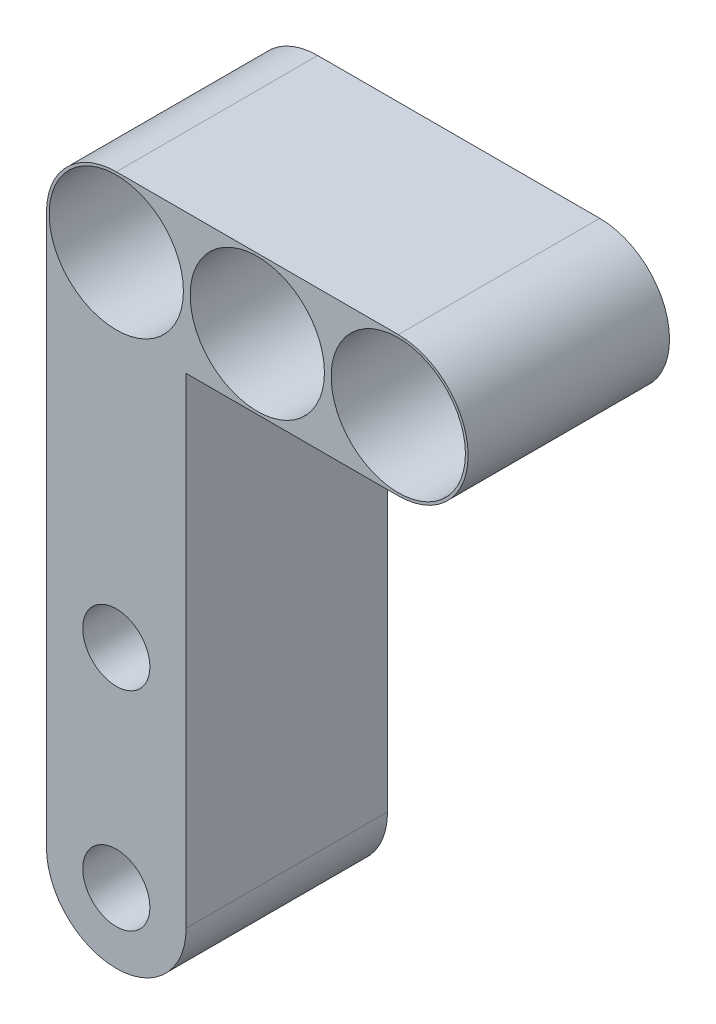
ISO-10303-21;
HEADER;
FILE_DESCRIPTION(('STEP AP214'),'2;1');
FILE_NAME('part.step','',(''),(''),'','','');
FILE_SCHEMA(('AUTOMOTIVE_DESIGN { 1 0 10303 214 1 1 1 1 }'));
ENDSEC;
DATA;
#1=APPLICATION_CONTEXT('core data for automotive mechanical design processes');
#2=APPLICATION_PROTOCOL_DEFINITION('international standard','automotive_design',2000,#1);
#3=PRODUCT_CONTEXT('',#1,'mechanical');
#4=PRODUCT('Part','Part','',(#3));
#5=PRODUCT_RELATED_PRODUCT_CATEGORY('part','',(#4));
#6=PRODUCT_DEFINITION_FORMATION('','',#4);
#7=PRODUCT_DEFINITION_CONTEXT('part definition',#1,'design');
#8=PRODUCT_DEFINITION('design','',#6,#7);
#9=PRODUCT_DEFINITION_SHAPE('','',#8);
#10=(LENGTH_UNIT() NAMED_UNIT(*) SI_UNIT(.MILLI.,.METRE.));
#11=(NAMED_UNIT(*) PLANE_ANGLE_UNIT() SI_UNIT($,.RADIAN.));
#12=(NAMED_UNIT(*) SI_UNIT($,.STERADIAN.) SOLID_ANGLE_UNIT());
#13=UNCERTAINTY_MEASURE_WITH_UNIT(LENGTH_MEASURE(1.E-05),#10,'distance_accuracy_value','');
#14=(GEOMETRIC_REPRESENTATION_CONTEXT(3) GLOBAL_UNCERTAINTY_ASSIGNED_CONTEXT((#13)) GLOBAL_UNIT_ASSIGNED_CONTEXT((#10,
#11,#12)) REPRESENTATION_CONTEXT('',''));
#15=CARTESIAN_POINT('',(0.,0.,0.));
#16=DIRECTION('',(0.,0.,1.));
#17=DIRECTION('',(1.,0.,0.));
#18=AXIS2_PLACEMENT_3D('',#15,#16,#17);
#19=CARTESIAN_POINT('',(0.,-0.52,1.5));
#20=DIRECTION('',(0.,1.,0.));
#21=DIRECTION('',(0.,0.,1.));
#22=AXIS2_PLACEMENT_3D('',#19,#20,#21);
#23=PLANE('',#22);
#24=DIRECTION('',(1.,0.,0.));
#25=VECTOR('',#24,1.);
#26=CARTESIAN_POINT('',(0.,-0.52,0.));
#27=LINE('',#26,#25);
#28=CARTESIAN_POINT('',(0.520000000000016,-0.52,0.));
#29=VERTEX_POINT('',#28);
#30=CARTESIAN_POINT('',(2.1,-0.52,0.));
#31=VERTEX_POINT('',#30);
#32=EDGE_CURVE('E142',#29,#31,#27,.T.);
#33=ORIENTED_EDGE('',*,*,#32,.T.);
#34=DIRECTION('',(0.,0.,-1.));
#35=VECTOR('',#34,1.);
#36=CARTESIAN_POINT('',(2.1,-0.52,1.5));
#37=LINE('',#36,#35);
#38=CARTESIAN_POINT('',(2.1,-0.52,1.5));
#39=VERTEX_POINT('',#38);
#40=EDGE_CURVE('E11',#39,#31,#37,.T.);
#41=ORIENTED_EDGE('',*,*,#40,.F.);
#42=DIRECTION('',(1.,0.,0.));
#43=VECTOR('',#42,1.);
#44=CARTESIAN_POINT('',(0.,-0.52,1.5));
#45=LINE('',#44,#43);
#46=CARTESIAN_POINT('',(0.520000000000016,-0.52,1.5));
#47=VERTEX_POINT('',#46);
#48=EDGE_CURVE('E171',#47,#39,#45,.T.);
#49=ORIENTED_EDGE('',*,*,#48,.F.);
#50=DIRECTION('',(0.,0.,-1.));
#51=VECTOR('',#50,1.);
#52=CARTESIAN_POINT('',(0.520000000000016,-0.52,1.5));
#53=LINE('',#52,#51);
#54=EDGE_CURVE('E141',#47,#29,#53,.T.);
#55=ORIENTED_EDGE('',*,*,#54,.T.);
#56=EDGE_LOOP('',(#33,#41,#49,#55));
#57=FACE_BOUND('',#56,.T.);
#58=ADVANCED_FACE('F35',(#57),#23,.F.);
#59=CARTESIAN_POINT('',(2.1,0.,1.5));
#60=DIRECTION('',(0.,0.,-1.));
#61=DIRECTION('',(-1.,0.,0.));
#62=AXIS2_PLACEMENT_3D('',#59,#60,#61);
#63=CYLINDRICAL_SURFACE('',#62,0.52);
#64=CARTESIAN_POINT('',(2.1,0.,0.));
#65=DIRECTION('',(0.,0.,1.));
#66=DIRECTION('',(1.,0.,0.));
#67=AXIS2_PLACEMENT_3D('',#64,#65,#66);
#68=CIRCLE('',#67,0.52);
#69=CARTESIAN_POINT('',(2.1,0.52,0.));
#70=VERTEX_POINT('',#69);
#71=EDGE_CURVE('E145',#31,#70,#68,.T.);
#72=ORIENTED_EDGE('',*,*,#71,.T.);
#73=DIRECTION('',(0.,0.,-1.));
#74=VECTOR('',#73,1.);
#75=CARTESIAN_POINT('',(2.1,0.52,1.5));
#76=LINE('',#75,#74);
#77=CARTESIAN_POINT('',(2.1,0.52,1.5));
#78=VERTEX_POINT('',#77);
#79=EDGE_CURVE('E43',#78,#70,#76,.T.);
#80=ORIENTED_EDGE('',*,*,#79,.F.);
#81=CARTESIAN_POINT('',(2.1,0.,1.5));
#82=DIRECTION('',(0.,0.,1.));
#83=DIRECTION('',(1.,0.,0.));
#84=AXIS2_PLACEMENT_3D('',#81,#82,#83);
#85=CIRCLE('',#84,0.52);
#86=EDGE_CURVE('E91',#39,#78,#85,.T.);
#87=ORIENTED_EDGE('',*,*,#86,.F.);
#88=ORIENTED_EDGE('',*,*,#40,.T.);
#89=EDGE_LOOP('',(#72,#80,#87,#88));
#90=FACE_BOUND('',#89,.T.);
#91=ADVANCED_FACE('F181',(#90),#63,.T.);
#92=CARTESIAN_POINT('',(0.,0.52,1.5));
#93=DIRECTION('',(0.,1.,0.));
#94=DIRECTION('',(0.,0.,1.));
#95=AXIS2_PLACEMENT_3D('',#92,#93,#94);
#96=PLANE('',#95);
#97=DIRECTION('',(1.,0.,0.));
#98=VECTOR('',#97,1.);
#99=CARTESIAN_POINT('',(0.,0.52,0.));
#100=LINE('',#99,#98);
#101=CARTESIAN_POINT('',(0.,0.52,0.));
#102=VERTEX_POINT('',#101);
#103=EDGE_CURVE('E148',#102,#70,#100,.T.);
#104=ORIENTED_EDGE('',*,*,#103,.F.);
#105=DIRECTION('',(0.,0.,-1.));
#106=VECTOR('',#105,1.);
#107=CARTESIAN_POINT('',(0.,0.52,1.5));
#108=LINE('',#107,#106);
#109=CARTESIAN_POINT('',(0.,0.52,1.5));
#110=VERTEX_POINT('',#109);
#111=EDGE_CURVE('E175',#110,#102,#108,.T.);
#112=ORIENTED_EDGE('',*,*,#111,.F.);
#113=DIRECTION('',(1.,0.,0.));
#114=VECTOR('',#113,1.);
#115=CARTESIAN_POINT('',(0.,0.52,1.5));
#116=LINE('',#115,#114);
#117=EDGE_CURVE('E180',#110,#78,#116,.T.);
#118=ORIENTED_EDGE('',*,*,#117,.T.);
#119=ORIENTED_EDGE('',*,*,#79,.T.);
#120=EDGE_LOOP('',(#104,#112,#118,#119));
#121=FACE_BOUND('',#120,.T.);
#122=ADVANCED_FACE('F179',(#121),#96,.T.);
#123=CARTESIAN_POINT('',(0.,0.,1.5));
#124=DIRECTION('',(0.,0.,-1.));
#125=DIRECTION('',(-1.,0.,0.));
#126=AXIS2_PLACEMENT_3D('',#123,#124,#125);
#127=CYLINDRICAL_SURFACE('',#126,0.52);
#128=CARTESIAN_POINT('',(0.,0.,0.));
#129=DIRECTION('',(0.,0.,1.));
#130=DIRECTION('',(1.,0.,0.));
#131=AXIS2_PLACEMENT_3D('',#128,#129,#130);
#132=CIRCLE('',#131,0.52);
#133=CARTESIAN_POINT('',(-0.52,0.,0.));
#134=VERTEX_POINT('',#133);
#135=EDGE_CURVE('E151',#102,#134,#132,.T.);
#136=ORIENTED_EDGE('',*,*,#135,.T.);
#137=DIRECTION('',(0.,0.,-1.));
#138=VECTOR('',#137,1.);
#139=CARTESIAN_POINT('',(-0.52,0.,1.5));
#140=LINE('',#139,#138);
#141=CARTESIAN_POINT('',(-0.52,0.,1.5));
#142=VERTEX_POINT('',#141);
#143=EDGE_CURVE('E118',#142,#134,#140,.T.);
#144=ORIENTED_EDGE('',*,*,#143,.F.);
#145=CARTESIAN_POINT('',(0.,0.,1.5));
#146=DIRECTION('',(0.,0.,1.));
#147=DIRECTION('',(1.,0.,0.));
#148=AXIS2_PLACEMENT_3D('',#145,#146,#147);
#149=CIRCLE('',#148,0.52);
#150=EDGE_CURVE('E109',#110,#142,#149,.T.);
#151=ORIENTED_EDGE('',*,*,#150,.F.);
#152=ORIENTED_EDGE('',*,*,#111,.T.);
#153=EDGE_LOOP('',(#136,#144,#151,#152));
#154=FACE_BOUND('',#153,.T.);
#155=ADVANCED_FACE('F189',(#154),#127,.T.);
#156=CARTESIAN_POINT('',(-0.52,0.,1.5));
#157=DIRECTION('',(1.,0.,0.));
#158=DIRECTION('',(0.,1.,0.));
#159=AXIS2_PLACEMENT_3D('',#156,#157,#158);
#160=PLANE('',#159);
#161=DIRECTION('',(0.,-1.,0.));
#162=VECTOR('',#161,1.);
#163=CARTESIAN_POINT('',(-0.52,0.,0.));
#164=LINE('',#163,#162);
#165=CARTESIAN_POINT('',(-0.519999999999984,-4.09838830326005,0.));
#166=VERTEX_POINT('',#165);
#167=EDGE_CURVE('E117',#134,#166,#164,.T.);
#168=ORIENTED_EDGE('',*,*,#167,.T.);
#169=DIRECTION('',(0.,0.,-1.));
#170=VECTOR('',#169,1.);
#171=CARTESIAN_POINT('',(-0.519999999999984,-4.09838830326005,1.5));
#172=LINE('',#171,#170);
#173=CARTESIAN_POINT('',(-0.519999999999984,-4.09838830326005,1.5));
#174=VERTEX_POINT('',#173);
#175=EDGE_CURVE('E114',#174,#166,#172,.T.);
#176=ORIENTED_EDGE('',*,*,#175,.F.);
#177=DIRECTION('',(0.,-1.,0.));
#178=VECTOR('',#177,1.);
#179=CARTESIAN_POINT('',(-0.52,0.,1.5));
#180=LINE('',#179,#178);
#181=EDGE_CURVE('E101',#142,#174,#180,.T.);
#182=ORIENTED_EDGE('',*,*,#181,.F.);
#183=ORIENTED_EDGE('',*,*,#143,.T.);
#184=EDGE_LOOP('',(#168,#176,#182,#183));
#185=FACE_BOUND('',#184,.T.);
#186=ADVANCED_FACE('F115',(#185),#160,.F.);
#187=CARTESIAN_POINT('',(0.,-4.09838830326005,1.5));
#188=DIRECTION('',(0.,0.,-1.));
#189=DIRECTION('',(-1.,0.,0.));
#190=AXIS2_PLACEMENT_3D('',#187,#188,#189);
#191=CYLINDRICAL_SURFACE('',#190,0.52);
#192=CARTESIAN_POINT('',(0.,-4.09838830326005,0.));
#193=DIRECTION('',(0.,0.,1.));
#194=DIRECTION('',(1.,0.,0.));
#195=AXIS2_PLACEMENT_3D('',#192,#193,#194);
#196=CIRCLE('',#195,0.52);
#197=CARTESIAN_POINT('',(0.520000000000016,-4.09838830326005,0.));
#198=VERTEX_POINT('',#197);
#199=EDGE_CURVE('E77',#166,#198,#196,.T.);
#200=ORIENTED_EDGE('',*,*,#199,.T.);
#201=DIRECTION('',(0.,0.,-1.));
#202=VECTOR('',#201,1.);
#203=CARTESIAN_POINT('',(0.520000000000016,-4.09838830326005,1.5));
#204=LINE('',#203,#202);
#205=CARTESIAN_POINT('',(0.520000000000016,-4.09838830326005,1.5));
#206=VERTEX_POINT('',#205);
#207=EDGE_CURVE('E119',#206,#198,#204,.T.);
#208=ORIENTED_EDGE('',*,*,#207,.F.);
#209=CARTESIAN_POINT('',(0.,-4.09838830326005,1.5));
#210=DIRECTION('',(0.,0.,1.));
#211=DIRECTION('',(1.,0.,0.));
#212=AXIS2_PLACEMENT_3D('',#209,#210,#211);
#213=CIRCLE('',#212,0.52);
#214=EDGE_CURVE('E106',#174,#206,#213,.T.);
#215=ORIENTED_EDGE('',*,*,#214,.F.);
#216=ORIENTED_EDGE('',*,*,#175,.T.);
#217=EDGE_LOOP('',(#200,#208,#215,#216));
#218=FACE_BOUND('',#217,.T.);
#219=ADVANCED_FACE('F121',(#218),#191,.T.);
#220=CARTESIAN_POINT('',(0.,-2.54838830326005,1.5));
#221=DIRECTION('',(0.,0.,-1.));
#222=DIRECTION('',(-1.,0.,0.));
#223=AXIS2_PLACEMENT_3D('',#220,#221,#222);
#224=CYLINDRICAL_SURFACE('',#223,0.25);
#225=CARTESIAN_POINT('',(0.,-2.54838830326005,1.5));
#226=DIRECTION('',(0.,0.,1.));
#227=DIRECTION('',(1.,0.,0.));
#228=AXIS2_PLACEMENT_3D('',#225,#226,#227);
#229=CIRCLE('',#228,0.25);
#230=CARTESIAN_POINT('',(0.25,-2.54838830326005,1.5));
#231=VERTEX_POINT('',#230);
#232=EDGE_CURVE('E135',#231,#231,#229,.T.);
#233=ORIENTED_EDGE('',*,*,#232,.T.);
#234=EDGE_LOOP('',(#233));
#235=FACE_BOUND('',#234,.T.);
#236=CARTESIAN_POINT('',(0.,-2.54838830326005,0.));
#237=DIRECTION('',(0.,0.,1.));
#238=DIRECTION('',(1.,0.,0.));
#239=AXIS2_PLACEMENT_3D('',#236,#237,#238);
#240=CIRCLE('',#239,0.25);
#241=CARTESIAN_POINT('',(0.25,-2.54838830326005,0.));
#242=VERTEX_POINT('',#241);
#243=EDGE_CURVE('E165',#242,#242,#240,.T.);
#244=ORIENTED_EDGE('',*,*,#243,.F.);
#245=EDGE_LOOP('',(#244));
#246=FACE_BOUND('',#245,.T.);
#247=ADVANCED_FACE('F223',(#235,#246),#224,.F.);
#248=CARTESIAN_POINT('',(0.,0.,1.5));
#249=DIRECTION('',(0.,0.,-1.));
#250=DIRECTION('',(-1.,0.,0.));
#251=AXIS2_PLACEMENT_3D('',#248,#249,#250);
#252=CYLINDRICAL_SURFACE('',#251,0.5);
#253=CARTESIAN_POINT('',(0.,0.,1.5));
#254=DIRECTION('',(0.,0.,1.));
#255=DIRECTION('',(1.,0.,0.));
#256=AXIS2_PLACEMENT_3D('',#253,#254,#255);
#257=CIRCLE('',#256,0.5);
#258=CARTESIAN_POINT('',(0.5,0.,1.5));
#259=VERTEX_POINT('',#258);
#260=EDGE_CURVE('E132',#259,#259,#257,.T.);
#261=ORIENTED_EDGE('',*,*,#260,.T.);
#262=EDGE_LOOP('',(#261));
#263=FACE_BOUND('',#262,.T.);
#264=CARTESIAN_POINT('',(0.,0.,0.));
#265=DIRECTION('',(0.,0.,1.));
#266=DIRECTION('',(1.,0.,0.));
#267=AXIS2_PLACEMENT_3D('',#264,#265,#266);
#268=CIRCLE('',#267,0.5);
#269=CARTESIAN_POINT('',(0.5,0.,0.));
#270=VERTEX_POINT('',#269);
#271=EDGE_CURVE('E162',#270,#270,#268,.T.);
#272=ORIENTED_EDGE('',*,*,#271,.F.);
#273=EDGE_LOOP('',(#272));
#274=FACE_BOUND('',#273,.T.);
#275=ADVANCED_FACE('F227',(#263,#274),#252,.F.);
#276=CARTESIAN_POINT('',(2.1,0.,1.5));
#277=DIRECTION('',(0.,0.,-1.));
#278=DIRECTION('',(-1.,0.,0.));
#279=AXIS2_PLACEMENT_3D('',#276,#277,#278);
#280=CYLINDRICAL_SURFACE('',#279,0.5);
#281=CARTESIAN_POINT('',(2.1,0.,1.5));
#282=DIRECTION('',(0.,0.,1.));
#283=DIRECTION('',(1.,0.,0.));
#284=AXIS2_PLACEMENT_3D('',#281,#282,#283);
#285=CIRCLE('',#284,0.5);
#286=CARTESIAN_POINT('',(2.6,0.,1.5));
#287=VERTEX_POINT('',#286);
#288=EDGE_CURVE('E129',#287,#287,#285,.T.);
#289=ORIENTED_EDGE('',*,*,#288,.T.);
#290=EDGE_LOOP('',(#289));
#291=FACE_BOUND('',#290,.T.);
#292=CARTESIAN_POINT('',(2.1,0.,0.));
#293=DIRECTION('',(0.,0.,1.));
#294=DIRECTION('',(1.,0.,0.));
#295=AXIS2_PLACEMENT_3D('',#292,#293,#294);
#296=CIRCLE('',#295,0.5);
#297=CARTESIAN_POINT('',(2.6,0.,0.));
#298=VERTEX_POINT('',#297);
#299=EDGE_CURVE('E159',#298,#298,#296,.T.);
#300=ORIENTED_EDGE('',*,*,#299,.F.);
#301=EDGE_LOOP('',(#300));
#302=FACE_BOUND('',#301,.T.);
#303=ADVANCED_FACE('F206',(#291,#302),#280,.F.);
#304=CARTESIAN_POINT('',(1.05,0.,1.5));
#305=DIRECTION('',(0.,0.,-1.));
#306=DIRECTION('',(-1.,0.,0.));
#307=AXIS2_PLACEMENT_3D('',#304,#305,#306);
#308=CYLINDRICAL_SURFACE('',#307,0.5);
#309=CARTESIAN_POINT('',(1.05,0.,1.5));
#310=DIRECTION('',(0.,0.,1.));
#311=DIRECTION('',(1.,0.,0.));
#312=AXIS2_PLACEMENT_3D('',#309,#310,#311);
#313=CIRCLE('',#312,0.5);
#314=CARTESIAN_POINT('',(1.55,0.,1.5));
#315=VERTEX_POINT('',#314);
#316=EDGE_CURVE('E123',#315,#315,#313,.T.);
#317=ORIENTED_EDGE('',*,*,#316,.T.);
#318=EDGE_LOOP('',(#317));
#319=FACE_BOUND('',#318,.T.);
#320=CARTESIAN_POINT('',(1.05,0.,0.));
#321=DIRECTION('',(0.,0.,1.));
#322=DIRECTION('',(1.,0.,0.));
#323=AXIS2_PLACEMENT_3D('',#320,#321,#322);
#324=CIRCLE('',#323,0.5);
#325=CARTESIAN_POINT('',(1.55,0.,0.));
#326=VERTEX_POINT('',#325);
#327=EDGE_CURVE('E156',#326,#326,#324,.T.);
#328=ORIENTED_EDGE('',*,*,#327,.F.);
#329=EDGE_LOOP('',(#328));
#330=FACE_BOUND('',#329,.T.);
#331=ADVANCED_FACE('F198',(#319,#330),#308,.F.);
#332=CARTESIAN_POINT('',(0.520000000000016,0.,1.5));
#333=DIRECTION('',(-1.,0.,0.));
#334=DIRECTION('',(0.,0.,1.));
#335=AXIS2_PLACEMENT_3D('',#332,#333,#334);
#336=PLANE('',#335);
#337=DIRECTION('',(0.,1.,0.));
#338=VECTOR('',#337,1.);
#339=CARTESIAN_POINT('',(0.520000000000016,0.,0.));
#340=LINE('',#339,#338);
#341=EDGE_CURVE('E83',#198,#29,#340,.T.);
#342=ORIENTED_EDGE('',*,*,#341,.T.);
#343=ORIENTED_EDGE('',*,*,#54,.F.);
#344=DIRECTION('',(0.,1.,0.));
#345=VECTOR('',#344,1.);
#346=CARTESIAN_POINT('',(0.520000000000016,0.,1.5));
#347=LINE('',#346,#345);
#348=EDGE_CURVE('E51',#206,#47,#347,.T.);
#349=ORIENTED_EDGE('',*,*,#348,.F.);
#350=ORIENTED_EDGE('',*,*,#207,.T.);
#351=EDGE_LOOP('',(#342,#343,#349,#350));
#352=FACE_BOUND('',#351,.T.);
#353=ADVANCED_FACE('F195',(#352),#336,.F.);
#354=CARTESIAN_POINT('',(0.,-4.09838830326005,1.5));
#355=DIRECTION('',(0.,0.,-1.));
#356=DIRECTION('',(-1.,0.,0.));
#357=AXIS2_PLACEMENT_3D('',#354,#355,#356);
#358=CYLINDRICAL_SURFACE('',#357,0.25);
#359=CARTESIAN_POINT('',(0.,-4.09838830326005,1.5));
#360=DIRECTION('',(0.,0.,1.));
#361=DIRECTION('',(1.,0.,0.));
#362=AXIS2_PLACEMENT_3D('',#359,#360,#361);
#363=CIRCLE('',#362,0.25);
#364=CARTESIAN_POINT('',(0.250000000000016,-4.09838830326005,1.5));
#365=VERTEX_POINT('',#364);
#366=EDGE_CURVE('E138',#365,#365,#363,.T.);
#367=ORIENTED_EDGE('',*,*,#366,.T.);
#368=EDGE_LOOP('',(#367));
#369=FACE_BOUND('',#368,.T.);
#370=CARTESIAN_POINT('',(0.,-4.09838830326005,0.));
#371=DIRECTION('',(0.,0.,1.));
#372=DIRECTION('',(1.,0.,0.));
#373=AXIS2_PLACEMENT_3D('',#370,#371,#372);
#374=CIRCLE('',#373,0.25);
#375=CARTESIAN_POINT('',(0.250000000000016,-4.09838830326005,0.));
#376=VERTEX_POINT('',#375);
#377=EDGE_CURVE('E168',#376,#376,#374,.T.);
#378=ORIENTED_EDGE('',*,*,#377,.F.);
#379=EDGE_LOOP('',(#378));
#380=FACE_BOUND('',#379,.T.);
#381=ADVANCED_FACE('F197',(#369,#380),#358,.F.);
#382=CARTESIAN_POINT('',(0.,0.,1.5));
#383=DIRECTION('',(0.,0.,1.));
#384=DIRECTION('',(1.,0.,0.));
#385=AXIS2_PLACEMENT_3D('',#382,#383,#384);
#386=PLANE('',#385);
#387=ORIENTED_EDGE('',*,*,#48,.T.);
#388=ORIENTED_EDGE('',*,*,#86,.T.);
#389=ORIENTED_EDGE('',*,*,#117,.F.);
#390=ORIENTED_EDGE('',*,*,#150,.T.);
#391=ORIENTED_EDGE('',*,*,#181,.T.);
#392=ORIENTED_EDGE('',*,*,#214,.T.);
#393=ORIENTED_EDGE('',*,*,#348,.T.);
#394=EDGE_LOOP('',(#387,#388,#389,#390,#391,#392,#393));
#395=FACE_BOUND('',#394,.T.);
#396=ORIENTED_EDGE('',*,*,#316,.F.);
#397=EDGE_LOOP('',(#396));
#398=FACE_BOUND('',#397,.T.);
#399=ORIENTED_EDGE('',*,*,#288,.F.);
#400=EDGE_LOOP('',(#399));
#401=FACE_BOUND('',#400,.T.);
#402=ORIENTED_EDGE('',*,*,#260,.F.);
#403=EDGE_LOOP('',(#402));
#404=FACE_BOUND('',#403,.T.);
#405=ORIENTED_EDGE('',*,*,#232,.F.);
#406=EDGE_LOOP('',(#405));
#407=FACE_BOUND('',#406,.T.);
#408=ORIENTED_EDGE('',*,*,#366,.F.);
#409=EDGE_LOOP('',(#408));
#410=FACE_BOUND('',#409,.T.);
#411=ADVANCED_FACE('F103',(#395,#398,#401,#404,#407,#410),#386,.T.);
#412=CARTESIAN_POINT('',(0.,0.,0.));
#413=DIRECTION('',(0.,0.,1.));
#414=DIRECTION('',(1.,0.,0.));
#415=AXIS2_PLACEMENT_3D('',#412,#413,#414);
#416=PLANE('',#415);
#417=ORIENTED_EDGE('',*,*,#32,.F.);
#418=ORIENTED_EDGE('',*,*,#341,.F.);
#419=ORIENTED_EDGE('',*,*,#199,.F.);
#420=ORIENTED_EDGE('',*,*,#167,.F.);
#421=ORIENTED_EDGE('',*,*,#135,.F.);
#422=ORIENTED_EDGE('',*,*,#103,.T.);
#423=ORIENTED_EDGE('',*,*,#71,.F.);
#424=EDGE_LOOP('',(#417,#418,#419,#420,#421,#422,#423));
#425=FACE_BOUND('',#424,.T.);
#426=ORIENTED_EDGE('',*,*,#327,.T.);
#427=EDGE_LOOP('',(#426));
#428=FACE_BOUND('',#427,.T.);
#429=ORIENTED_EDGE('',*,*,#299,.T.);
#430=EDGE_LOOP('',(#429));
#431=FACE_BOUND('',#430,.T.);
#432=ORIENTED_EDGE('',*,*,#271,.T.);
#433=EDGE_LOOP('',(#432));
#434=FACE_BOUND('',#433,.T.);
#435=ORIENTED_EDGE('',*,*,#243,.T.);
#436=EDGE_LOOP('',(#435));
#437=FACE_BOUND('',#436,.T.);
#438=ORIENTED_EDGE('',*,*,#377,.T.);
#439=EDGE_LOOP('',(#438));
#440=FACE_BOUND('',#439,.T.);
#441=ADVANCED_FACE('F186',(#425,#428,#431,#434,#437,#440),#416,.F.);
#442=CLOSED_SHELL('',(#58,#91,#122,#155,#186,#219,#247,#275,#303,#331,#353,#381,#411,#441));
#443=MANIFOLD_SOLID_BREP('B2',#442);
#444=ADVANCED_BREP_SHAPE_REPRESENTATION('',(#18,#443),#14);
#445=SHAPE_DEFINITION_REPRESENTATION(#9,#444);
ENDSEC;
END-ISO-10303-21;
